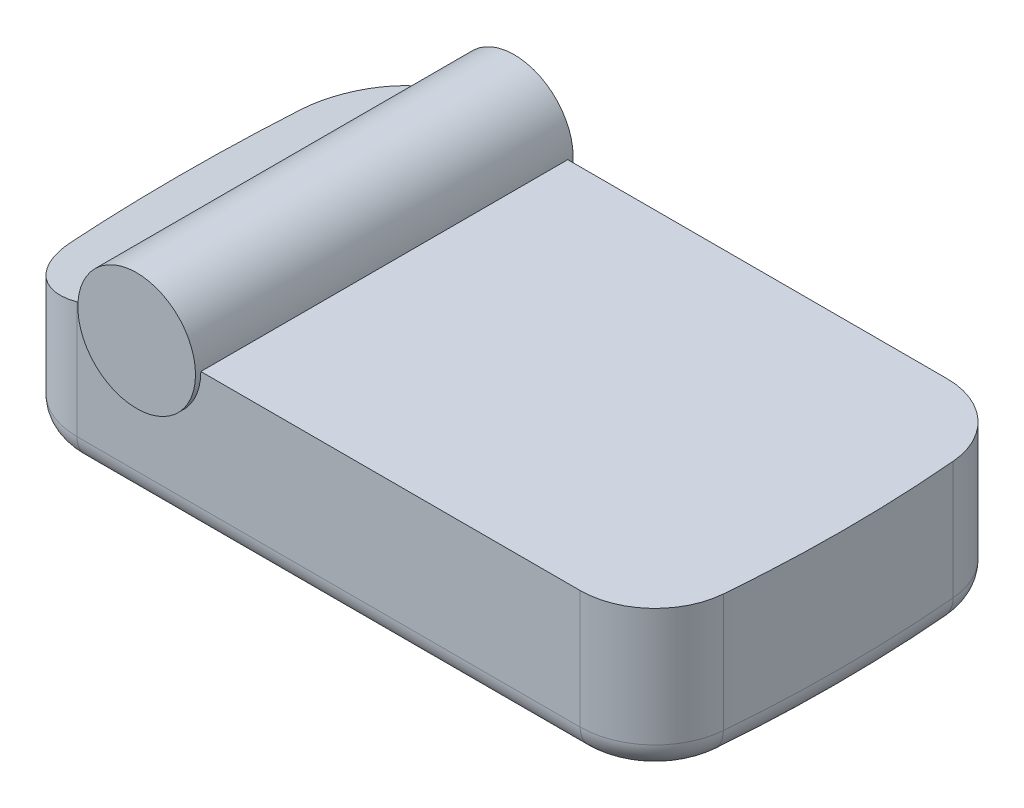
ISO-10303-21;
HEADER;
FILE_DESCRIPTION(('STEP AP214'),'2;1');
FILE_NAME('part.step','',(''),(''),'','','');
FILE_SCHEMA(('AUTOMOTIVE_DESIGN { 1 0 10303 214 1 1 1 1 }'));
ENDSEC;
DATA;
#1=APPLICATION_CONTEXT('core data for automotive mechanical design processes');
#2=APPLICATION_PROTOCOL_DEFINITION('international standard','automotive_design',2000,#1);
#3=PRODUCT_CONTEXT('',#1,'mechanical');
#4=PRODUCT('Part','Part','',(#3));
#5=PRODUCT_RELATED_PRODUCT_CATEGORY('part','',(#4));
#6=PRODUCT_DEFINITION_FORMATION('','',#4);
#7=PRODUCT_DEFINITION_CONTEXT('part definition',#1,'design');
#8=PRODUCT_DEFINITION('design','',#6,#7);
#9=PRODUCT_DEFINITION_SHAPE('','',#8);
#10=(LENGTH_UNIT() NAMED_UNIT(*) SI_UNIT(.MILLI.,.METRE.));
#11=(NAMED_UNIT(*) PLANE_ANGLE_UNIT() SI_UNIT($,.RADIAN.));
#12=(NAMED_UNIT(*) SI_UNIT($,.STERADIAN.) SOLID_ANGLE_UNIT());
#13=UNCERTAINTY_MEASURE_WITH_UNIT(LENGTH_MEASURE(1.E-05),#10,'distance_accuracy_value','');
#14=(GEOMETRIC_REPRESENTATION_CONTEXT(3) GLOBAL_UNCERTAINTY_ASSIGNED_CONTEXT((#13)) GLOBAL_UNIT_ASSIGNED_CONTEXT((#10,
#11,#12)) REPRESENTATION_CONTEXT('',''));
#15=CARTESIAN_POINT('',(0.,0.,0.));
#16=DIRECTION('',(0.,0.,1.));
#17=DIRECTION('',(1.,0.,0.));
#18=AXIS2_PLACEMENT_3D('',#15,#16,#17);
#19=CARTESIAN_POINT('',(23.5199690557792,13.6,-10.15));
#20=DIRECTION('',(0.,-1.,0.));
#21=DIRECTION('',(0.,0.,-1.));
#22=AXIS2_PLACEMENT_3D('',#19,#20,#21);
#23=PLANE('',#22);
#24=DIRECTION('',(-1.,0.,0.));
#25=VECTOR('',#24,1.);
#26=CARTESIAN_POINT('',(-23.5199690557792,13.6,-17.15));
#27=LINE('',#26,#25);
#28=CARTESIAN_POINT('',(23.5199690557792,13.6,-17.15));
#29=VERTEX_POINT('',#28);
#30=CARTESIAN_POINT('',(-11.9389939517277,13.6,-17.15));
#31=VERTEX_POINT('',#30);
#32=EDGE_CURVE('E301',#29,#31,#27,.T.);
#33=ORIENTED_EDGE('',*,*,#32,.T.);
#34=DIRECTION('',(0.,0.,1.));
#35=VECTOR('',#34,1.);
#36=CARTESIAN_POINT('',(-11.9389939517277,13.6,-33.706349186104));
#37=LINE('',#36,#35);
#38=CARTESIAN_POINT('',(-11.9389939517277,13.6,17.15));
#39=VERTEX_POINT('',#38);
#40=EDGE_CURVE('E13',#31,#39,#37,.T.);
#41=ORIENTED_EDGE('',*,*,#40,.T.);
#42=DIRECTION('',(1.,0.,0.));
#43=VECTOR('',#42,1.);
#44=CARTESIAN_POINT('',(-23.5199690557792,13.6,17.15));
#45=LINE('',#44,#43);
#46=CARTESIAN_POINT('',(23.5199690557792,13.6,17.15));
#47=VERTEX_POINT('',#46);
#48=EDGE_CURVE('E304',#39,#47,#45,.T.);
#49=ORIENTED_EDGE('',*,*,#48,.T.);
#50=CARTESIAN_POINT('',(23.5199690557792,13.6,10.15));
#51=DIRECTION('',(0.,1.,0.));
#52=DIRECTION('',(0.,0.,1.));
#53=AXIS2_PLACEMENT_3D('',#50,#51,#52);
#54=CIRCLE('',#53,7.);
#55=CARTESIAN_POINT('',(30.4948839173663,13.6,10.7420833333333));
#56=VERTEX_POINT('',#55);
#57=EDGE_CURVE('E307',#47,#56,#54,.T.);
#58=ORIENTED_EDGE('',*,*,#57,.T.);
#59=CARTESIAN_POINT('',(-96.05,13.6,0.));
#60=DIRECTION('',(0.,1.,0.));
#61=DIRECTION('',(0.,0.,-1.));
#62=AXIS2_PLACEMENT_3D('',#59,#60,#61);
#63=CIRCLE('',#62,127.);
#64=CARTESIAN_POINT('',(30.4948839173663,13.6,-10.7420833333333));
#65=VERTEX_POINT('',#64);
#66=EDGE_CURVE('E310',#56,#65,#63,.T.);
#67=ORIENTED_EDGE('',*,*,#66,.T.);
#68=CARTESIAN_POINT('',(23.5199690557792,13.6,-10.15));
#69=DIRECTION('',(0.,1.,0.));
#70=DIRECTION('',(0.,0.,-1.));
#71=AXIS2_PLACEMENT_3D('',#68,#69,#70);
#72=CIRCLE('',#71,6.99999999999999);
#73=EDGE_CURVE('E273',#65,#29,#72,.T.);
#74=ORIENTED_EDGE('',*,*,#73,.T.);
#75=EDGE_LOOP('',(#33,#41,#49,#58,#67,#74));
#76=FACE_BOUND('',#75,.T.);
#77=ADVANCED_FACE('F51',(#76),#23,.F.);
#78=CARTESIAN_POINT('',(23.5199690557792,13.6,-10.15));
#79=DIRECTION('',(0.,-1.,0.));
#80=DIRECTION('',(0.,0.,-1.));
#81=AXIS2_PLACEMENT_3D('',#78,#79,#80);
#82=CYLINDRICAL_SURFACE('',#81,6.99999999999999);
#83=DIRECTION('',(0.,-1.,0.));
#84=VECTOR('',#83,1.);
#85=CARTESIAN_POINT('',(30.4948839173663,13.6,-10.7420833333333));
#86=LINE('',#85,#84);
#87=CARTESIAN_POINT('',(30.4948839173663,2.54,-10.7420833333333));
#88=VERTEX_POINT('',#87);
#89=EDGE_CURVE('E313',#65,#88,#86,.T.);
#90=ORIENTED_EDGE('',*,*,#89,.T.);
#91=CARTESIAN_POINT('',(23.5199690557792,2.54,-10.15));
#92=DIRECTION('',(0.,-1.,0.));
#93=DIRECTION('',(0.,0.,-1.));
#94=AXIS2_PLACEMENT_3D('',#91,#92,#93);
#95=CIRCLE('',#94,6.99999999999999);
#96=CARTESIAN_POINT('',(23.5199690557792,2.54,-17.15));
#97=VERTEX_POINT('',#96);
#98=EDGE_CURVE('E225',#88,#97,#95,.F.);
#99=ORIENTED_EDGE('',*,*,#98,.T.);
#100=DIRECTION('',(0.,-1.,0.));
#101=VECTOR('',#100,1.);
#102=CARTESIAN_POINT('',(23.5199690557792,13.6,-17.15));
#103=LINE('',#102,#101);
#104=EDGE_CURVE('E188',#29,#97,#103,.T.);
#105=ORIENTED_EDGE('',*,*,#104,.F.);
#106=ORIENTED_EDGE('',*,*,#73,.F.);
#107=EDGE_LOOP('',(#90,#99,#105,#106));
#108=FACE_BOUND('',#107,.T.);
#109=ADVANCED_FACE('F343',(#108),#82,.T.);
#110=CARTESIAN_POINT('',(-23.5199690557792,13.6,-17.15));
#111=DIRECTION('',(0.,0.,1.));
#112=DIRECTION('',(1.,0.,0.));
#113=AXIS2_PLACEMENT_3D('',#110,#111,#112);
#114=PLANE('',#113);
#115=DIRECTION('',(0.,-1.,0.));
#116=VECTOR('',#115,1.);
#117=CARTESIAN_POINT('',(-23.5199690557792,13.6,-17.15));
#118=LINE('',#117,#116);
#119=CARTESIAN_POINT('',(-23.5199690557792,13.4443281900468,-17.15));
#120=VERTEX_POINT('',#119);
#121=CARTESIAN_POINT('',(-23.5199690557792,2.54,-17.15));
#122=VERTEX_POINT('',#121);
#123=EDGE_CURVE('E185',#120,#122,#118,.T.);
#124=ORIENTED_EDGE('',*,*,#123,.F.);
#125=DIRECTION('',(0.96592582628907,0.258819045102515,0.));
#126=VECTOR('',#125,1.);
#127=CARTESIAN_POINT('',(-23.4810511032909,13.4547562239871,-17.15));
#128=LINE('',#127,#126);
#129=CARTESIAN_POINT('',(-22.9389939517277,13.6,-17.15));
#130=VERTEX_POINT('',#129);
#131=EDGE_CURVE('E276',#120,#130,#128,.T.);
#132=ORIENTED_EDGE('',*,*,#131,.T.);
#133=CARTESIAN_POINT('',(-17.4389939517277,13.6,-17.15));
#134=DIRECTION('',(0.,0.,1.));
#135=DIRECTION('',(1.,0.,0.));
#136=AXIS2_PLACEMENT_3D('',#133,#134,#135);
#137=CIRCLE('',#136,5.5);
#138=EDGE_CURVE('E247',#130,#31,#137,.T.);
#139=ORIENTED_EDGE('',*,*,#138,.T.);
#140=ORIENTED_EDGE('',*,*,#32,.F.);
#141=ORIENTED_EDGE('',*,*,#104,.T.);
#142=DIRECTION('',(-1.,0.,0.));
#143=VECTOR('',#142,1.);
#144=CARTESIAN_POINT('',(-23.5199690557792,2.54,-17.15));
#145=LINE('',#144,#143);
#146=EDGE_CURVE('E221',#97,#122,#145,.T.);
#147=ORIENTED_EDGE('',*,*,#146,.T.);
#148=EDGE_LOOP('',(#124,#132,#139,#140,#141,#147));
#149=FACE_BOUND('',#148,.T.);
#150=ADVANCED_FACE('F283',(#149),#114,.F.);
#151=CARTESIAN_POINT('',(-23.5199690557792,13.6,-10.15));
#152=DIRECTION('',(0.,-1.,0.));
#153=DIRECTION('',(0.,0.,-1.));
#154=AXIS2_PLACEMENT_3D('',#151,#152,#153);
#155=CYLINDRICAL_SURFACE('',#154,6.99999999999999);
#156=DIRECTION('',(0.,-1.,0.));
#157=VECTOR('',#156,1.);
#158=CARTESIAN_POINT('',(-30.4948839173664,13.6,-10.7420833333333));
#159=LINE('',#158,#157);
#160=CARTESIAN_POINT('',(-30.4948839173664,11.5754053856088,-10.7420833333333));
#161=VERTEX_POINT('',#160);
#162=CARTESIAN_POINT('',(-30.4948839173664,2.54,-10.7420833333333));
#163=VERTEX_POINT('',#162);
#164=EDGE_CURVE('E176',#161,#163,#159,.T.);
#165=ORIENTED_EDGE('',*,*,#164,.F.);
#166=CARTESIAN_POINT('',(-23.5199690557792,13.4443281900468,-10.15));
#167=DIRECTION('',(0.258819045102515,-0.96592582628907,0.));
#168=DIRECTION('',(-0.96592582628907,-0.258819045102515,0.));
#169=AXIS2_PLACEMENT_3D('',#166,#167,#168);
#170=ELLIPSE('',#169,7.24693326287056,6.99999999999999);
#171=EDGE_CURVE('E287',#161,#120,#170,.T.);
#172=ORIENTED_EDGE('',*,*,#171,.T.);
#173=ORIENTED_EDGE('',*,*,#123,.T.);
#174=CARTESIAN_POINT('',(-23.5199690557792,2.54,-10.15));
#175=DIRECTION('',(0.,-1.,0.));
#176=DIRECTION('',(0.,0.,-1.));
#177=AXIS2_PLACEMENT_3D('',#174,#175,#176);
#178=CIRCLE('',#177,6.99999999999999);
#179=EDGE_CURVE('E192',#122,#163,#178,.F.);
#180=ORIENTED_EDGE('',*,*,#179,.T.);
#181=EDGE_LOOP('',(#165,#172,#173,#180));
#182=FACE_BOUND('',#181,.T.);
#183=ADVANCED_FACE('F371',(#182),#155,.T.);
#184=CARTESIAN_POINT('',(96.05,13.6,0.));
#185=DIRECTION('',(0.,-1.,0.));
#186=DIRECTION('',(0.,0.,-1.));
#187=AXIS2_PLACEMENT_3D('',#184,#185,#186);
#188=CYLINDRICAL_SURFACE('',#187,127.);
#189=CARTESIAN_POINT('',(96.05,45.4830048375564,0.));
#190=DIRECTION('',(0.258819045102515,-0.96592582628907,0.));
#191=DIRECTION('',(-0.96592582628907,-0.258819045102515,0.));
#192=AXIS2_PLACEMENT_3D('',#189,#190,#191);
#193=ELLIPSE('',#192,131.48007491208,127.);
#194=CARTESIAN_POINT('',(-30.4948839173664,11.5754053856088,10.7420833333333));
#195=VERTEX_POINT('',#194);
#196=EDGE_CURVE('E158',#195,#161,#193,.T.);
#197=ORIENTED_EDGE('',*,*,#196,.T.);
#198=ORIENTED_EDGE('',*,*,#164,.T.);
#199=CARTESIAN_POINT('',(96.05,2.54,0.));
#200=DIRECTION('',(0.,-1.,0.));
#201=DIRECTION('',(0.,0.,-1.));
#202=AXIS2_PLACEMENT_3D('',#199,#200,#201);
#203=CIRCLE('',#202,127.);
#204=CARTESIAN_POINT('',(-30.4948839173664,2.54,10.7420833333333));
#205=VERTEX_POINT('',#204);
#206=EDGE_CURVE('E239',#163,#205,#203,.F.);
#207=ORIENTED_EDGE('',*,*,#206,.T.);
#208=DIRECTION('',(0.,-1.,0.));
#209=VECTOR('',#208,1.);
#210=CARTESIAN_POINT('',(-30.4948839173664,13.6,10.7420833333333));
#211=LINE('',#210,#209);
#212=EDGE_CURVE('E67',#195,#205,#211,.T.);
#213=ORIENTED_EDGE('',*,*,#212,.F.);
#214=EDGE_LOOP('',(#197,#198,#207,#213));
#215=FACE_BOUND('',#214,.T.);
#216=ADVANCED_FACE('F413',(#215),#188,.T.);
#217=CARTESIAN_POINT('',(-23.5199690557792,13.6,10.15));
#218=DIRECTION('',(0.,-1.,0.));
#219=DIRECTION('',(0.,0.,-1.));
#220=AXIS2_PLACEMENT_3D('',#217,#218,#219);
#221=CYLINDRICAL_SURFACE('',#220,7.);
#222=DIRECTION('',(0.,-1.,0.));
#223=VECTOR('',#222,1.);
#224=CARTESIAN_POINT('',(-23.5199690557792,13.6,17.15));
#225=LINE('',#224,#223);
#226=CARTESIAN_POINT('',(-23.5199690557792,13.4443281900468,17.15));
#227=VERTEX_POINT('',#226);
#228=CARTESIAN_POINT('',(-23.5199690557792,2.54,17.15));
#229=VERTEX_POINT('',#228);
#230=EDGE_CURVE('E75',#227,#229,#225,.T.);
#231=ORIENTED_EDGE('',*,*,#230,.F.);
#232=CARTESIAN_POINT('',(-23.5199690557792,13.4443281900468,10.15));
#233=DIRECTION('',(0.258819045102515,-0.96592582628907,0.));
#234=DIRECTION('',(-0.96592582628907,-0.258819045102515,0.));
#235=AXIS2_PLACEMENT_3D('',#232,#233,#234);
#236=ELLIPSE('',#235,7.24693326287057,7.);
#237=EDGE_CURVE('E153',#227,#195,#236,.T.);
#238=ORIENTED_EDGE('',*,*,#237,.T.);
#239=ORIENTED_EDGE('',*,*,#212,.T.);
#240=CARTESIAN_POINT('',(-23.5199690557792,2.54,10.15));
#241=DIRECTION('',(0.,-1.,0.));
#242=DIRECTION('',(0.,0.,-1.));
#243=AXIS2_PLACEMENT_3D('',#240,#241,#242);
#244=CIRCLE('',#243,7.);
#245=EDGE_CURVE('E169',#205,#229,#244,.F.);
#246=ORIENTED_EDGE('',*,*,#245,.T.);
#247=EDGE_LOOP('',(#231,#238,#239,#246));
#248=FACE_BOUND('',#247,.T.);
#249=ADVANCED_FACE('F167',(#248),#221,.T.);
#250=CARTESIAN_POINT('',(-23.5199690557792,13.6,17.15));
#251=DIRECTION('',(0.,0.,-1.));
#252=DIRECTION('',(-1.,0.,0.));
#253=AXIS2_PLACEMENT_3D('',#250,#251,#252);
#254=PLANE('',#253);
#255=CARTESIAN_POINT('',(-17.4389939517277,13.6,17.15));
#256=DIRECTION('',(0.,0.,-1.));
#257=DIRECTION('',(-1.,0.,0.));
#258=AXIS2_PLACEMENT_3D('',#255,#256,#257);
#259=CIRCLE('',#258,5.5);
#260=CARTESIAN_POINT('',(-22.9389939517277,13.6,17.15));
#261=VERTEX_POINT('',#260);
#262=EDGE_CURVE('E164',#39,#261,#259,.T.);
#263=ORIENTED_EDGE('',*,*,#262,.T.);
#264=DIRECTION('',(0.96592582628907,0.258819045102515,0.));
#265=VECTOR('',#264,1.);
#266=CARTESIAN_POINT('',(-22.9389939517277,13.6,17.15));
#267=LINE('',#266,#265);
#268=EDGE_CURVE('E156',#227,#261,#267,.T.);
#269=ORIENTED_EDGE('',*,*,#268,.F.);
#270=ORIENTED_EDGE('',*,*,#230,.T.);
#271=DIRECTION('',(1.,0.,0.));
#272=VECTOR('',#271,1.);
#273=CARTESIAN_POINT('',(23.5199690557792,2.54,17.15));
#274=LINE('',#273,#272);
#275=CARTESIAN_POINT('',(23.5199690557792,2.54,17.15));
#276=VERTEX_POINT('',#275);
#277=EDGE_CURVE('E231',#229,#276,#274,.T.);
#278=ORIENTED_EDGE('',*,*,#277,.T.);
#279=DIRECTION('',(0.,-1.,0.));
#280=VECTOR('',#279,1.);
#281=CARTESIAN_POINT('',(23.5199690557792,13.6,17.15));
#282=LINE('',#281,#280);
#283=EDGE_CURVE('E172',#47,#276,#282,.T.);
#284=ORIENTED_EDGE('',*,*,#283,.F.);
#285=ORIENTED_EDGE('',*,*,#48,.F.);
#286=EDGE_LOOP('',(#263,#269,#270,#278,#284,#285));
#287=FACE_BOUND('',#286,.T.);
#288=ADVANCED_FACE('F162',(#287),#254,.F.);
#289=CARTESIAN_POINT('',(23.5199690557792,13.6,10.15));
#290=DIRECTION('',(0.,-1.,0.));
#291=DIRECTION('',(0.,0.,-1.));
#292=AXIS2_PLACEMENT_3D('',#289,#290,#291);
#293=CYLINDRICAL_SURFACE('',#292,7.);
#294=ORIENTED_EDGE('',*,*,#283,.T.);
#295=CARTESIAN_POINT('',(23.5199690557792,2.54,10.15));
#296=DIRECTION('',(0.,-1.,0.));
#297=DIRECTION('',(0.,0.,-1.));
#298=AXIS2_PLACEMENT_3D('',#295,#296,#297);
#299=CIRCLE('',#298,7.);
#300=CARTESIAN_POINT('',(30.4948839173663,2.54,10.7420833333333));
#301=VERTEX_POINT('',#300);
#302=EDGE_CURVE('E228',#276,#301,#299,.F.);
#303=ORIENTED_EDGE('',*,*,#302,.T.);
#304=DIRECTION('',(0.,-1.,0.));
#305=VECTOR('',#304,1.);
#306=CARTESIAN_POINT('',(30.4948839173663,13.6,10.7420833333333));
#307=LINE('',#306,#305);
#308=EDGE_CURVE('E179',#56,#301,#307,.T.);
#309=ORIENTED_EDGE('',*,*,#308,.F.);
#310=ORIENTED_EDGE('',*,*,#57,.F.);
#311=EDGE_LOOP('',(#294,#303,#309,#310));
#312=FACE_BOUND('',#311,.T.);
#313=ADVANCED_FACE('F348',(#312),#293,.T.);
#314=CARTESIAN_POINT('',(-96.05,13.6,0.));
#315=DIRECTION('',(0.,-1.,0.));
#316=DIRECTION('',(0.,0.,-1.));
#317=AXIS2_PLACEMENT_3D('',#314,#315,#316);
#318=CYLINDRICAL_SURFACE('',#317,127.);
#319=ORIENTED_EDGE('',*,*,#308,.T.);
#320=CARTESIAN_POINT('',(-96.05,2.54,0.));
#321=DIRECTION('',(0.,-1.,0.));
#322=DIRECTION('',(0.,0.,-1.));
#323=AXIS2_PLACEMENT_3D('',#320,#321,#322);
#324=CIRCLE('',#323,127.);
#325=EDGE_CURVE('E236',#301,#88,#324,.F.);
#326=ORIENTED_EDGE('',*,*,#325,.T.);
#327=ORIENTED_EDGE('',*,*,#89,.F.);
#328=ORIENTED_EDGE('',*,*,#66,.F.);
#329=EDGE_LOOP('',(#319,#326,#327,#328));
#330=FACE_BOUND('',#329,.T.);
#331=ADVANCED_FACE('F322',(#330),#318,.T.);
#332=CARTESIAN_POINT('',(23.5199690557792,0.,-10.15));
#333=DIRECTION('',(0.,-1.,0.));
#334=DIRECTION('',(0.,0.,-1.));
#335=AXIS2_PLACEMENT_3D('',#332,#333,#334);
#336=PLANE('',#335);
#337=CARTESIAN_POINT('',(-23.5199690557792,0.,-10.15));
#338=DIRECTION('',(0.,-1.,0.));
#339=DIRECTION('',(0.,0.,-1.));
#340=AXIS2_PLACEMENT_3D('',#337,#338,#339);
#341=CIRCLE('',#340,4.45999999999999);
#342=CARTESIAN_POINT('',(-27.963986239019,0.,-10.5272416666667));
#343=VERTEX_POINT('',#342);
#344=CARTESIAN_POINT('',(-23.5199690557792,0.,-14.61));
#345=VERTEX_POINT('',#344);
#346=EDGE_CURVE('E208',#343,#345,#341,.T.);
#347=ORIENTED_EDGE('',*,*,#346,.T.);
#348=DIRECTION('',(-1.,0.,0.));
#349=VECTOR('',#348,1.);
#350=CARTESIAN_POINT('',(23.5199690557792,0.,-14.61));
#351=LINE('',#350,#349);
#352=CARTESIAN_POINT('',(23.5199690557792,0.,-14.61));
#353=VERTEX_POINT('',#352);
#354=EDGE_CURVE('E218',#345,#353,#351,.F.);
#355=ORIENTED_EDGE('',*,*,#354,.T.);
#356=CARTESIAN_POINT('',(23.5199690557792,0.,-10.15));
#357=DIRECTION('',(0.,-1.,0.));
#358=DIRECTION('',(0.,0.,-1.));
#359=AXIS2_PLACEMENT_3D('',#356,#357,#358);
#360=CIRCLE('',#359,4.45999999999998);
#361=CARTESIAN_POINT('',(27.963986239019,0.,-10.5272416666667));
#362=VERTEX_POINT('',#361);
#363=EDGE_CURVE('E215',#353,#362,#360,.T.);
#364=ORIENTED_EDGE('',*,*,#363,.T.);
#365=CARTESIAN_POINT('',(-96.05,0.,0.));
#366=DIRECTION('',(0.,-1.,0.));
#367=DIRECTION('',(0.,0.,-1.));
#368=AXIS2_PLACEMENT_3D('',#365,#366,#367);
#369=CIRCLE('',#368,124.46);
#370=CARTESIAN_POINT('',(27.963986239019,0.,10.5272416666667));
#371=VERTEX_POINT('',#370);
#372=EDGE_CURVE('E212',#362,#371,#369,.T.);
#373=ORIENTED_EDGE('',*,*,#372,.T.);
#374=CARTESIAN_POINT('',(23.5199690557792,0.,10.15));
#375=DIRECTION('',(0.,-1.,0.));
#376=DIRECTION('',(0.,0.,-1.));
#377=AXIS2_PLACEMENT_3D('',#374,#375,#376);
#378=CIRCLE('',#377,4.46);
#379=CARTESIAN_POINT('',(23.5199690557792,0.,14.61));
#380=VERTEX_POINT('',#379);
#381=EDGE_CURVE('E205',#371,#380,#378,.T.);
#382=ORIENTED_EDGE('',*,*,#381,.T.);
#383=DIRECTION('',(1.,0.,0.));
#384=VECTOR('',#383,1.);
#385=CARTESIAN_POINT('',(-23.5199690557792,0.,14.61));
#386=LINE('',#385,#384);
#387=CARTESIAN_POINT('',(-23.5199690557792,0.,14.61));
#388=VERTEX_POINT('',#387);
#389=EDGE_CURVE('E202',#380,#388,#386,.F.);
#390=ORIENTED_EDGE('',*,*,#389,.T.);
#391=CARTESIAN_POINT('',(-23.5199690557792,0.,10.15));
#392=DIRECTION('',(0.,-1.,0.));
#393=DIRECTION('',(0.,0.,-1.));
#394=AXIS2_PLACEMENT_3D('',#391,#392,#393);
#395=CIRCLE('',#394,4.46);
#396=CARTESIAN_POINT('',(-27.963986239019,0.,10.5272416666666));
#397=VERTEX_POINT('',#396);
#398=EDGE_CURVE('E199',#388,#397,#395,.T.);
#399=ORIENTED_EDGE('',*,*,#398,.T.);
#400=CARTESIAN_POINT('',(96.05,0.,0.));
#401=DIRECTION('',(0.,-1.,0.));
#402=DIRECTION('',(0.,0.,-1.));
#403=AXIS2_PLACEMENT_3D('',#400,#401,#402);
#404=CIRCLE('',#403,124.46);
#405=EDGE_CURVE('E196',#397,#343,#404,.T.);
#406=ORIENTED_EDGE('',*,*,#405,.T.);
#407=EDGE_LOOP('',(#347,#355,#364,#373,#382,#390,#399,#406));
#408=FACE_BOUND('',#407,.T.);
#409=ADVANCED_FACE('F359',(#408),#336,.T.);
#410=CARTESIAN_POINT('',(23.5199690557792,2.54,10.15));
#411=DIRECTION('',(0.,-1.,0.));
#412=DIRECTION('',(0.,0.,-1.));
#413=AXIS2_PLACEMENT_3D('',#410,#411,#412);
#414=TOROIDAL_SURFACE('',#413,4.46,2.54);
#415=CARTESIAN_POINT('',(23.5199690557792,2.54,14.61));
#416=DIRECTION('',(-1.,0.,0.));
#417=DIRECTION('',(0.,0.,1.));
#418=AXIS2_PLACEMENT_3D('',#415,#416,#417);
#419=CIRCLE('',#418,2.54);
#420=EDGE_CURVE('E266',#380,#276,#419,.T.);
#421=ORIENTED_EDGE('',*,*,#420,.F.);
#422=ORIENTED_EDGE('',*,*,#381,.F.);
#423=CARTESIAN_POINT('',(27.963986239019,2.54,10.5272416666667));
#424=DIRECTION('',(0.0845833333333333,0.,-0.99641640879816));
#425=DIRECTION('',(-0.99641640879816,0.,-0.0845833333333333));
#426=AXIS2_PLACEMENT_3D('',#423,#424,#425);
#427=CIRCLE('',#426,2.54);
#428=EDGE_CURVE('E270',#301,#371,#427,.T.);
#429=ORIENTED_EDGE('',*,*,#428,.F.);
#430=ORIENTED_EDGE('',*,*,#302,.F.);
#431=EDGE_LOOP('',(#421,#422,#429,#430));
#432=FACE_BOUND('',#431,.T.);
#433=ADVANCED_FACE('F53',(#432),#414,.T.);
#434=CARTESIAN_POINT('',(-96.05,2.54,0.));
#435=DIRECTION('',(0.,-1.,0.));
#436=DIRECTION('',(0.,0.,-1.));
#437=AXIS2_PLACEMENT_3D('',#434,#435,#436);
#438=TOROIDAL_SURFACE('',#437,124.46,2.54);
#439=ORIENTED_EDGE('',*,*,#428,.T.);
#440=ORIENTED_EDGE('',*,*,#372,.F.);
#441=CARTESIAN_POINT('',(27.963986239019,2.54,-10.5272416666667));
#442=DIRECTION('',(-0.0845833333333333,0.,-0.99641640879816));
#443=DIRECTION('',(-0.99641640879816,0.,0.0845833333333333));
#444=AXIS2_PLACEMENT_3D('',#441,#442,#443);
#445=CIRCLE('',#444,2.54);
#446=EDGE_CURVE('E262',#88,#362,#445,.T.);
#447=ORIENTED_EDGE('',*,*,#446,.F.);
#448=ORIENTED_EDGE('',*,*,#325,.F.);
#449=EDGE_LOOP('',(#439,#440,#447,#448));
#450=FACE_BOUND('',#449,.T.);
#451=ADVANCED_FACE('F334',(#450),#438,.T.);
#452=CARTESIAN_POINT('',(-23.5199690557792,2.54,14.61));
#453=DIRECTION('',(-1.,0.,0.));
#454=DIRECTION('',(0.,0.,1.));
#455=AXIS2_PLACEMENT_3D('',#452,#453,#454);
#456=CYLINDRICAL_SURFACE('',#455,2.54);
#457=ORIENTED_EDGE('',*,*,#420,.T.);
#458=ORIENTED_EDGE('',*,*,#277,.F.);
#459=CARTESIAN_POINT('',(-23.5199690557792,2.54,14.61));
#460=DIRECTION('',(-1.,0.,0.));
#461=DIRECTION('',(0.,0.,1.));
#462=AXIS2_PLACEMENT_3D('',#459,#460,#461);
#463=CIRCLE('',#462,2.54);
#464=EDGE_CURVE('E258',#388,#229,#463,.T.);
#465=ORIENTED_EDGE('',*,*,#464,.F.);
#466=ORIENTED_EDGE('',*,*,#389,.F.);
#467=EDGE_LOOP('',(#457,#458,#465,#466));
#468=FACE_BOUND('',#467,.T.);
#469=ADVANCED_FACE('F351',(#468),#456,.T.);
#470=CARTESIAN_POINT('',(23.5199690557792,2.54,-10.15));
#471=DIRECTION('',(0.,-1.,0.));
#472=DIRECTION('',(0.,0.,-1.));
#473=AXIS2_PLACEMENT_3D('',#470,#471,#472);
#474=TOROIDAL_SURFACE('',#473,4.45999999999998,2.54);
#475=ORIENTED_EDGE('',*,*,#446,.T.);
#476=ORIENTED_EDGE('',*,*,#363,.F.);
#477=CARTESIAN_POINT('',(23.5199690557792,2.54,-14.61));
#478=DIRECTION('',(-1.,0.,0.));
#479=DIRECTION('',(0.,0.,1.));
#480=AXIS2_PLACEMENT_3D('',#477,#478,#479);
#481=CIRCLE('',#480,2.54);
#482=EDGE_CURVE('E254',#97,#353,#481,.T.);
#483=ORIENTED_EDGE('',*,*,#482,.F.);
#484=ORIENTED_EDGE('',*,*,#98,.F.);
#485=EDGE_LOOP('',(#475,#476,#483,#484));
#486=FACE_BOUND('',#485,.T.);
#487=ADVANCED_FACE('F339',(#486),#474,.T.);
#488=CARTESIAN_POINT('',(-23.5199690557792,2.54,10.15));
#489=DIRECTION('',(0.,-1.,0.));
#490=DIRECTION('',(0.,0.,-1.));
#491=AXIS2_PLACEMENT_3D('',#488,#489,#490);
#492=TOROIDAL_SURFACE('',#491,4.46,2.54);
#493=ORIENTED_EDGE('',*,*,#464,.T.);
#494=ORIENTED_EDGE('',*,*,#245,.F.);
#495=CARTESIAN_POINT('',(-27.963986239019,2.54,10.5272416666666));
#496=DIRECTION('',(-0.0845833333333272,0.,-0.996416408798161));
#497=DIRECTION('',(-0.996416408798161,0.,0.0845833333333272));
#498=AXIS2_PLACEMENT_3D('',#495,#496,#497);
#499=CIRCLE('',#498,2.54);
#500=EDGE_CURVE('E250',#397,#205,#499,.T.);
#501=ORIENTED_EDGE('',*,*,#500,.F.);
#502=ORIENTED_EDGE('',*,*,#398,.F.);
#503=EDGE_LOOP('',(#493,#494,#501,#502));
#504=FACE_BOUND('',#503,.T.);
#505=ADVANCED_FACE('F355',(#504),#492,.T.);
#506=CARTESIAN_POINT('',(-23.5199690557792,2.54,-14.61));
#507=DIRECTION('',(1.,0.,0.));
#508=DIRECTION('',(0.,0.,-1.));
#509=AXIS2_PLACEMENT_3D('',#506,#507,#508);
#510=CYLINDRICAL_SURFACE('',#509,2.54);
#511=ORIENTED_EDGE('',*,*,#482,.T.);
#512=ORIENTED_EDGE('',*,*,#354,.F.);
#513=CARTESIAN_POINT('',(-23.5199690557792,2.54,-14.61));
#514=DIRECTION('',(-1.,0.,0.));
#515=DIRECTION('',(0.,0.,1.));
#516=AXIS2_PLACEMENT_3D('',#513,#514,#515);
#517=CIRCLE('',#516,2.54);
#518=EDGE_CURVE('E246',#122,#345,#517,.T.);
#519=ORIENTED_EDGE('',*,*,#518,.F.);
#520=ORIENTED_EDGE('',*,*,#146,.F.);
#521=EDGE_LOOP('',(#511,#512,#519,#520));
#522=FACE_BOUND('',#521,.T.);
#523=ADVANCED_FACE('F363',(#522),#510,.T.);
#524=CARTESIAN_POINT('',(96.05,2.54,0.));
#525=DIRECTION('',(0.,-1.,0.));
#526=DIRECTION('',(0.,0.,-1.));
#527=AXIS2_PLACEMENT_3D('',#524,#525,#526);
#528=TOROIDAL_SURFACE('',#527,124.46,2.54);
#529=ORIENTED_EDGE('',*,*,#500,.T.);
#530=ORIENTED_EDGE('',*,*,#206,.F.);
#531=CARTESIAN_POINT('',(-27.963986239019,2.54,-10.5272416666667));
#532=DIRECTION('',(0.084583333333334,0.,-0.99641640879816));
#533=DIRECTION('',(-0.99641640879816,0.,-0.084583333333334));
#534=AXIS2_PLACEMENT_3D('',#531,#532,#533);
#535=CIRCLE('',#534,2.54);
#536=EDGE_CURVE('E242',#343,#163,#535,.T.);
#537=ORIENTED_EDGE('',*,*,#536,.F.);
#538=ORIENTED_EDGE('',*,*,#405,.F.);
#539=EDGE_LOOP('',(#529,#530,#537,#538));
#540=FACE_BOUND('',#539,.T.);
#541=ADVANCED_FACE('F394',(#540),#528,.T.);
#542=CARTESIAN_POINT('',(-23.5199690557792,2.54,-10.15));
#543=DIRECTION('',(0.,-1.,0.));
#544=DIRECTION('',(0.,0.,-1.));
#545=AXIS2_PLACEMENT_3D('',#542,#543,#544);
#546=TOROIDAL_SURFACE('',#545,4.45999999999999,2.54);
#547=ORIENTED_EDGE('',*,*,#518,.T.);
#548=ORIENTED_EDGE('',*,*,#346,.F.);
#549=ORIENTED_EDGE('',*,*,#536,.T.);
#550=ORIENTED_EDGE('',*,*,#179,.F.);
#551=EDGE_LOOP('',(#547,#548,#549,#550));
#552=FACE_BOUND('',#551,.T.);
#553=ADVANCED_FACE('F366',(#552),#546,.T.);
#554=CARTESIAN_POINT('',(-17.4389939517277,13.6,-33.706349186104));
#555=DIRECTION('',(0.,0.,1.));
#556=DIRECTION('',(1.,0.,0.));
#557=AXIS2_PLACEMENT_3D('',#554,#555,#556);
#558=CYLINDRICAL_SURFACE('',#557,5.5);
#559=ORIENTED_EDGE('',*,*,#138,.F.);
#560=DIRECTION('',(0.,0.,1.));
#561=VECTOR('',#560,1.);
#562=CARTESIAN_POINT('',(-22.9389939517277,13.6,-33.706349186104));
#563=LINE('',#562,#561);
#564=EDGE_CURVE('E60',#261,#130,#563,.F.);
#565=ORIENTED_EDGE('',*,*,#564,.F.);
#566=ORIENTED_EDGE('',*,*,#262,.F.);
#567=ORIENTED_EDGE('',*,*,#40,.F.);
#568=EDGE_LOOP('',(#559,#565,#566,#567));
#569=FACE_BOUND('',#568,.T.);
#570=CARTESIAN_POINT('',(-17.4389939517277,13.6,17.65));
#571=DIRECTION('',(0.,0.,1.));
#572=DIRECTION('',(1.,0.,0.));
#573=AXIS2_PLACEMENT_3D('',#570,#571,#572);
#574=CIRCLE('',#573,5.5);
#575=CARTESIAN_POINT('',(-11.9389939517277,13.6,17.65));
#576=VERTEX_POINT('',#575);
#577=EDGE_CURVE('E286',#576,#576,#574,.T.);
#578=ORIENTED_EDGE('',*,*,#577,.F.);
#579=EDGE_LOOP('',(#578));
#580=FACE_BOUND('',#579,.T.);
#581=CARTESIAN_POINT('',(-17.4389939517277,13.6,-17.65));
#582=DIRECTION('',(0.,0.,1.));
#583=DIRECTION('',(1.,0.,0.));
#584=AXIS2_PLACEMENT_3D('',#581,#582,#583);
#585=CIRCLE('',#584,5.5);
#586=CARTESIAN_POINT('',(-11.9389939517277,13.6,-17.65));
#587=VERTEX_POINT('',#586);
#588=EDGE_CURVE('E294',#587,#587,#585,.F.);
#589=ORIENTED_EDGE('',*,*,#588,.F.);
#590=EDGE_LOOP('',(#589));
#591=FACE_BOUND('',#590,.T.);
#592=ADVANCED_FACE('F289',(#569,#580,#591),#558,.T.);
#593=CARTESIAN_POINT('',(-23.5199690557792,13.6,-17.65));
#594=DIRECTION('',(0.,0.,1.));
#595=DIRECTION('',(1.,0.,0.));
#596=AXIS2_PLACEMENT_3D('',#593,#594,#595);
#597=PLANE('',#596);
#598=ORIENTED_EDGE('',*,*,#588,.T.);
#599=EDGE_LOOP('',(#598));
#600=FACE_BOUND('',#599,.T.);
#601=ADVANCED_FACE('F383',(#600),#597,.F.);
#602=CARTESIAN_POINT('',(-17.4389939517277,13.6,17.65));
#603=DIRECTION('',(0.,0.,1.));
#604=DIRECTION('',(1.,0.,0.));
#605=AXIS2_PLACEMENT_3D('',#602,#603,#604);
#606=PLANE('',#605);
#607=ORIENTED_EDGE('',*,*,#577,.T.);
#608=EDGE_LOOP('',(#607));
#609=FACE_BOUND('',#608,.T.);
#610=ADVANCED_FACE('F391',(#609),#606,.T.);
#611=CARTESIAN_POINT('',(-22.9389939517277,13.6,-17.65));
#612=DIRECTION('',(0.258819045102515,-0.96592582628907,0.));
#613=DIRECTION('',(0.96592582628907,0.258819045102515,0.));
#614=AXIS2_PLACEMENT_3D('',#611,#612,#613);
#615=PLANE('',#614);
#616=ORIENTED_EDGE('',*,*,#171,.F.);
#617=ORIENTED_EDGE('',*,*,#196,.F.);
#618=ORIENTED_EDGE('',*,*,#237,.F.);
#619=ORIENTED_EDGE('',*,*,#268,.T.);
#620=ORIENTED_EDGE('',*,*,#564,.T.);
#621=ORIENTED_EDGE('',*,*,#131,.F.);
#622=EDGE_LOOP('',(#616,#617,#618,#619,#620,#621));
#623=FACE_BOUND('',#622,.T.);
#624=ADVANCED_FACE('F155',(#623),#615,.F.);
#625=CLOSED_SHELL('',(#77,#109,#150,#183,#216,#249,#288,#313,#331,#409,#433,#451,#469,#487,#505,
#523,#541,#553,#592,#601,#610,#624));
#626=MANIFOLD_SOLID_BREP('B2',#625);
#627=ADVANCED_BREP_SHAPE_REPRESENTATION('',(#18,#626),#14);
#628=SHAPE_DEFINITION_REPRESENTATION(#9,#627);
ENDSEC;
END-ISO-10303-21;
